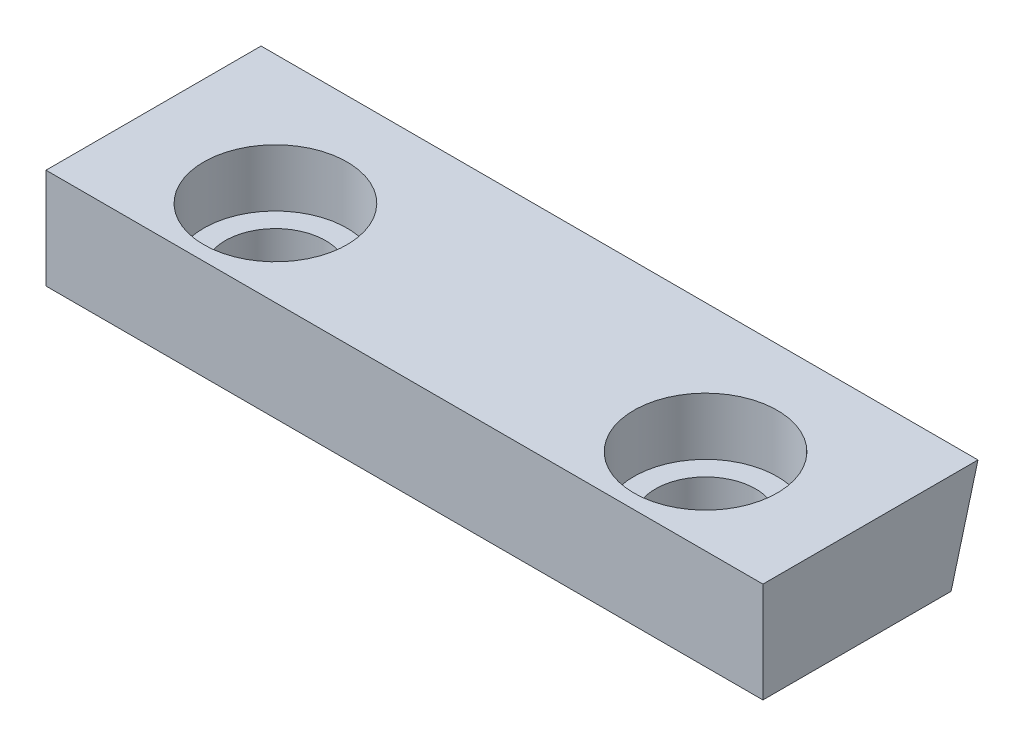
ISO-10303-21;
HEADER;
FILE_DESCRIPTION(('STEP AP214'),'2;1');
FILE_NAME('part.step','',(''),(''),'','','');
FILE_SCHEMA(('AUTOMOTIVE_DESIGN { 1 0 10303 214 1 1 1 1 }'));
ENDSEC;
DATA;
#1=APPLICATION_CONTEXT('core data for automotive mechanical design processes');
#2=APPLICATION_PROTOCOL_DEFINITION('international standard','automotive_design',2000,#1);
#3=PRODUCT_CONTEXT('',#1,'mechanical');
#4=PRODUCT('Part','Part','',(#3));
#5=PRODUCT_RELATED_PRODUCT_CATEGORY('part','',(#4));
#6=PRODUCT_DEFINITION_FORMATION('','',#4);
#7=PRODUCT_DEFINITION_CONTEXT('part definition',#1,'design');
#8=PRODUCT_DEFINITION('design','',#6,#7);
#9=PRODUCT_DEFINITION_SHAPE('','',#8);
#10=(LENGTH_UNIT() NAMED_UNIT(*) SI_UNIT(.MILLI.,.METRE.));
#11=(NAMED_UNIT(*) PLANE_ANGLE_UNIT() SI_UNIT($,.RADIAN.));
#12=(NAMED_UNIT(*) SI_UNIT($,.STERADIAN.) SOLID_ANGLE_UNIT());
#13=UNCERTAINTY_MEASURE_WITH_UNIT(LENGTH_MEASURE(1.E-05),#10,'distance_accuracy_value','');
#14=(GEOMETRIC_REPRESENTATION_CONTEXT(3) GLOBAL_UNCERTAINTY_ASSIGNED_CONTEXT((#13)) GLOBAL_UNIT_ASSIGNED_CONTEXT((#10,
#11,#12)) REPRESENTATION_CONTEXT('',''));
#15=CARTESIAN_POINT('',(0.,0.,0.));
#16=DIRECTION('',(0.,0.,1.));
#17=DIRECTION('',(1.,0.,0.));
#18=AXIS2_PLACEMENT_3D('',#15,#16,#17);
#19=CARTESIAN_POINT('',(-15.,7.,4.));
#20=DIRECTION('',(0.,1.,0.));
#21=DIRECTION('',(0.,0.,1.));
#22=AXIS2_PLACEMENT_3D('',#19,#20,#21);
#23=CYLINDRICAL_SURFACE('',#22,3.5);
#24=CARTESIAN_POINT('',(-15.,3.,4.));
#25=DIRECTION('',(0.,1.,0.));
#26=DIRECTION('',(0.,0.,1.));
#27=AXIS2_PLACEMENT_3D('',#24,#25,#26);
#28=CIRCLE('',#27,3.5);
#29=CARTESIAN_POINT('',(-15.,3.,7.5));
#30=VERTEX_POINT('',#29);
#31=EDGE_CURVE('E20',#30,#30,#28,.T.);
#32=ORIENTED_EDGE('',*,*,#31,.T.);
#33=EDGE_LOOP('',(#32));
#34=FACE_BOUND('',#33,.T.);
#35=CARTESIAN_POINT('',(-15.,0.,4.));
#36=DIRECTION('',(0.,1.,0.));
#37=DIRECTION('',(0.,0.,1.));
#38=AXIS2_PLACEMENT_3D('',#35,#36,#37);
#39=CIRCLE('',#38,3.5);
#40=CARTESIAN_POINT('',(-15.,0.,7.5));
#41=VERTEX_POINT('',#40);
#42=EDGE_CURVE('E96',#41,#41,#39,.T.);
#43=ORIENTED_EDGE('',*,*,#42,.F.);
#44=EDGE_LOOP('',(#43));
#45=FACE_BOUND('',#44,.T.);
#46=ADVANCED_FACE('F17',(#34,#45),#23,.F.);
#47=CARTESIAN_POINT('',(15.,7.,4.));
#48=DIRECTION('',(0.,1.,0.));
#49=DIRECTION('',(0.,0.,1.));
#50=AXIS2_PLACEMENT_3D('',#47,#48,#49);
#51=CYLINDRICAL_SURFACE('',#50,3.5);
#52=CARTESIAN_POINT('',(15.,3.,4.));
#53=DIRECTION('',(0.,1.,0.));
#54=DIRECTION('',(0.,0.,1.));
#55=AXIS2_PLACEMENT_3D('',#52,#53,#54);
#56=CIRCLE('',#55,3.5);
#57=CARTESIAN_POINT('',(15.,3.,7.5));
#58=VERTEX_POINT('',#57);
#59=EDGE_CURVE('E98',#58,#58,#56,.T.);
#60=ORIENTED_EDGE('',*,*,#59,.T.);
#61=EDGE_LOOP('',(#60));
#62=FACE_BOUND('',#61,.T.);
#63=CARTESIAN_POINT('',(15.,0.,4.));
#64=DIRECTION('',(0.,1.,0.));
#65=DIRECTION('',(0.,0.,1.));
#66=AXIS2_PLACEMENT_3D('',#63,#64,#65);
#67=CIRCLE('',#66,3.5);
#68=CARTESIAN_POINT('',(15.,0.,7.5));
#69=VERTEX_POINT('',#68);
#70=EDGE_CURVE('E93',#69,#69,#67,.T.);
#71=ORIENTED_EDGE('',*,*,#70,.F.);
#72=EDGE_LOOP('',(#71));
#73=FACE_BOUND('',#72,.T.);
#74=ADVANCED_FACE('F110',(#62,#73),#51,.F.);
#75=CARTESIAN_POINT('',(-11.5,3.,4.));
#76=DIRECTION('',(0.,-1.,0.));
#77=DIRECTION('',(0.,0.,-1.));
#78=AXIS2_PLACEMENT_3D('',#75,#76,#77);
#79=PLANE('',#78);
#80=CARTESIAN_POINT('',(-15.,3.,4.));
#81=DIRECTION('',(0.,1.,0.));
#82=DIRECTION('',(0.,0.,1.));
#83=AXIS2_PLACEMENT_3D('',#80,#81,#82);
#84=CIRCLE('',#83,5.);
#85=CARTESIAN_POINT('',(-15.,3.,9.));
#86=VERTEX_POINT('',#85);
#87=EDGE_CURVE('E90',#86,#86,#84,.T.);
#88=ORIENTED_EDGE('',*,*,#87,.T.);
#89=EDGE_LOOP('',(#88));
#90=FACE_BOUND('',#89,.T.);
#91=ORIENTED_EDGE('',*,*,#31,.F.);
#92=EDGE_LOOP('',(#91));
#93=FACE_BOUND('',#92,.T.);
#94=ADVANCED_FACE('F107',(#90,#93),#79,.F.);
#95=CARTESIAN_POINT('',(18.5,3.,4.));
#96=DIRECTION('',(0.,-1.,0.));
#97=DIRECTION('',(0.,0.,-1.));
#98=AXIS2_PLACEMENT_3D('',#95,#96,#97);
#99=PLANE('',#98);
#100=CARTESIAN_POINT('',(15.,3.,4.));
#101=DIRECTION('',(0.,1.,0.));
#102=DIRECTION('',(0.,0.,1.));
#103=AXIS2_PLACEMENT_3D('',#100,#101,#102);
#104=CIRCLE('',#103,5.);
#105=CARTESIAN_POINT('',(15.,3.,9.));
#106=VERTEX_POINT('',#105);
#107=EDGE_CURVE('E67',#106,#106,#104,.T.);
#108=ORIENTED_EDGE('',*,*,#107,.T.);
#109=EDGE_LOOP('',(#108));
#110=FACE_BOUND('',#109,.T.);
#111=ORIENTED_EDGE('',*,*,#59,.F.);
#112=EDGE_LOOP('',(#111));
#113=FACE_BOUND('',#112,.T.);
#114=ADVANCED_FACE('F109',(#110,#113),#99,.F.);
#115=CARTESIAN_POINT('',(0.,0.,0.));
#116=DIRECTION('',(0.,-1.,0.));
#117=DIRECTION('',(0.,0.,-1.));
#118=AXIS2_PLACEMENT_3D('',#115,#116,#117);
#119=PLANE('',#118);
#120=DIRECTION('',(0.,0.,1.));
#121=VECTOR('',#120,1.);
#122=CARTESIAN_POINT('',(25.,0.,10.));
#123=LINE('',#122,#121);
#124=CARTESIAN_POINT('',(25.,0.,-3.12435565298211));
#125=VERTEX_POINT('',#124);
#126=CARTESIAN_POINT('',(25.,0.,10.));
#127=VERTEX_POINT('',#126);
#128=EDGE_CURVE('E58',#125,#127,#123,.T.);
#129=ORIENTED_EDGE('',*,*,#128,.T.);
#130=DIRECTION('',(-1.,0.,0.));
#131=VECTOR('',#130,1.);
#132=CARTESIAN_POINT('',(-25.,0.,10.));
#133=LINE('',#132,#131);
#134=CARTESIAN_POINT('',(-25.,0.,10.));
#135=VERTEX_POINT('',#134);
#136=EDGE_CURVE('E55',#127,#135,#133,.T.);
#137=ORIENTED_EDGE('',*,*,#136,.T.);
#138=DIRECTION('',(0.,0.,-1.));
#139=VECTOR('',#138,1.);
#140=CARTESIAN_POINT('',(-25.,0.,10.));
#141=LINE('',#140,#139);
#142=CARTESIAN_POINT('',(-25.,0.,-3.12435565298211));
#143=VERTEX_POINT('',#142);
#144=EDGE_CURVE('E233',#135,#143,#141,.T.);
#145=ORIENTED_EDGE('',*,*,#144,.T.);
#146=DIRECTION('',(1.,0.,0.));
#147=VECTOR('',#146,1.);
#148=CARTESIAN_POINT('',(92.8808699119273,0.,-3.12435565298211));
#149=LINE('',#148,#147);
#150=EDGE_CURVE('E61',#125,#143,#149,.F.);
#151=ORIENTED_EDGE('',*,*,#150,.F.);
#152=EDGE_LOOP('',(#129,#137,#145,#151));
#153=FACE_BOUND('',#152,.T.);
#154=ORIENTED_EDGE('',*,*,#70,.T.);
#155=EDGE_LOOP('',(#154));
#156=FACE_BOUND('',#155,.T.);
#157=ORIENTED_EDGE('',*,*,#42,.T.);
#158=EDGE_LOOP('',(#157));
#159=FACE_BOUND('',#158,.T.);
#160=ADVANCED_FACE('F59',(#153,#156,#159),#119,.T.);
#161=CARTESIAN_POINT('',(-15.,7.,4.));
#162=DIRECTION('',(0.,1.,0.));
#163=DIRECTION('',(0.,0.,1.));
#164=AXIS2_PLACEMENT_3D('',#161,#162,#163);
#165=CYLINDRICAL_SURFACE('',#164,5.);
#166=ORIENTED_EDGE('',*,*,#87,.F.);
#167=EDGE_LOOP('',(#166));
#168=FACE_BOUND('',#167,.T.);
#169=CARTESIAN_POINT('',(-15.,7.,4.));
#170=DIRECTION('',(0.,1.,0.));
#171=DIRECTION('',(0.,0.,1.));
#172=AXIS2_PLACEMENT_3D('',#169,#170,#171);
#173=CIRCLE('',#172,5.);
#174=CARTESIAN_POINT('',(-15.,7.,9.));
#175=VERTEX_POINT('',#174);
#176=EDGE_CURVE('E85',#175,#175,#173,.T.);
#177=ORIENTED_EDGE('',*,*,#176,.T.);
#178=EDGE_LOOP('',(#177));
#179=FACE_BOUND('',#178,.T.);
#180=ADVANCED_FACE('F145',(#168,#179),#165,.F.);
#181=CARTESIAN_POINT('',(15.,7.,4.));
#182=DIRECTION('',(0.,1.,0.));
#183=DIRECTION('',(0.,0.,1.));
#184=AXIS2_PLACEMENT_3D('',#181,#182,#183);
#185=CYLINDRICAL_SURFACE('',#184,5.);
#186=ORIENTED_EDGE('',*,*,#107,.F.);
#187=EDGE_LOOP('',(#186));
#188=FACE_BOUND('',#187,.T.);
#189=CARTESIAN_POINT('',(15.,7.,4.));
#190=DIRECTION('',(0.,1.,0.));
#191=DIRECTION('',(0.,0.,1.));
#192=AXIS2_PLACEMENT_3D('',#189,#190,#191);
#193=CIRCLE('',#192,5.);
#194=CARTESIAN_POINT('',(15.,7.,9.));
#195=VERTEX_POINT('',#194);
#196=EDGE_CURVE('E82',#195,#195,#193,.T.);
#197=ORIENTED_EDGE('',*,*,#196,.T.);
#198=EDGE_LOOP('',(#197));
#199=FACE_BOUND('',#198,.T.);
#200=ADVANCED_FACE('F142',(#188,#199),#185,.F.);
#201=CARTESIAN_POINT('',(25.,7.,10.));
#202=DIRECTION('',(-1.,0.,0.));
#203=DIRECTION('',(0.,0.,1.));
#204=AXIS2_PLACEMENT_3D('',#201,#202,#203);
#205=PLANE('',#204);
#206=DIRECTION('',(0.,0.,-1.));
#207=VECTOR('',#206,1.);
#208=CARTESIAN_POINT('',(25.,7.,0.));
#209=LINE('',#208,#207);
#210=CARTESIAN_POINT('',(25.,7.,-5.));
#211=VERTEX_POINT('',#210);
#212=CARTESIAN_POINT('',(25.,7.,10.));
#213=VERTEX_POINT('',#212);
#214=EDGE_CURVE('E78',#211,#213,#209,.F.);
#215=ORIENTED_EDGE('',*,*,#214,.T.);
#216=DIRECTION('',(0.,1.,0.));
#217=VECTOR('',#216,1.);
#218=CARTESIAN_POINT('',(25.,7.,10.));
#219=LINE('',#218,#217);
#220=EDGE_CURVE('E66',#213,#127,#219,.F.);
#221=ORIENTED_EDGE('',*,*,#220,.T.);
#222=ORIENTED_EDGE('',*,*,#128,.F.);
#223=DIRECTION('',(0.,0.965925826289067,-0.258819045102525));
#224=VECTOR('',#223,1.);
#225=CARTESIAN_POINT('',(25.,7.,-5.));
#226=LINE('',#225,#224);
#227=EDGE_CURVE('E235',#211,#125,#226,.F.);
#228=ORIENTED_EDGE('',*,*,#227,.F.);
#229=EDGE_LOOP('',(#215,#221,#222,#228));
#230=FACE_BOUND('',#229,.T.);
#231=ADVANCED_FACE('F77',(#230),#205,.F.);
#232=CARTESIAN_POINT('',(-25.,7.,10.));
#233=DIRECTION('',(0.,0.,-1.));
#234=DIRECTION('',(-1.,0.,0.));
#235=AXIS2_PLACEMENT_3D('',#232,#233,#234);
#236=PLANE('',#235);
#237=ORIENTED_EDGE('',*,*,#220,.F.);
#238=DIRECTION('',(1.,0.,0.));
#239=VECTOR('',#238,1.);
#240=CARTESIAN_POINT('',(0.,7.,10.));
#241=LINE('',#240,#239);
#242=CARTESIAN_POINT('',(-25.,7.,10.));
#243=VERTEX_POINT('',#242);
#244=EDGE_CURVE('E242',#213,#243,#241,.F.);
#245=ORIENTED_EDGE('',*,*,#244,.T.);
#246=DIRECTION('',(0.,1.,0.));
#247=VECTOR('',#246,1.);
#248=CARTESIAN_POINT('',(-25.,7.,10.));
#249=LINE('',#248,#247);
#250=EDGE_CURVE('E74',#243,#135,#249,.F.);
#251=ORIENTED_EDGE('',*,*,#250,.T.);
#252=ORIENTED_EDGE('',*,*,#136,.F.);
#253=EDGE_LOOP('',(#237,#245,#251,#252));
#254=FACE_BOUND('',#253,.T.);
#255=ADVANCED_FACE('F71',(#254),#236,.F.);
#256=CARTESIAN_POINT('',(-25.,7.,10.));
#257=DIRECTION('',(1.,0.,0.));
#258=DIRECTION('',(0.,0.,-1.));
#259=AXIS2_PLACEMENT_3D('',#256,#257,#258);
#260=PLANE('',#259);
#261=ORIENTED_EDGE('',*,*,#144,.F.);
#262=ORIENTED_EDGE('',*,*,#250,.F.);
#263=DIRECTION('',(0.,0.,-1.));
#264=VECTOR('',#263,1.);
#265=CARTESIAN_POINT('',(-25.,7.,0.));
#266=LINE('',#265,#264);
#267=CARTESIAN_POINT('',(-25.,7.,-5.));
#268=VERTEX_POINT('',#267);
#269=EDGE_CURVE('E26',#243,#268,#266,.T.);
#270=ORIENTED_EDGE('',*,*,#269,.T.);
#271=DIRECTION('',(0.,0.965925826289067,-0.258819045102525));
#272=VECTOR('',#271,1.);
#273=CARTESIAN_POINT('',(-25.,7.,-5.));
#274=LINE('',#273,#272);
#275=EDGE_CURVE('E34',#143,#268,#274,.T.);
#276=ORIENTED_EDGE('',*,*,#275,.F.);
#277=EDGE_LOOP('',(#261,#262,#270,#276));
#278=FACE_BOUND('',#277,.T.);
#279=ADVANCED_FACE('F130',(#278),#260,.F.);
#280=CARTESIAN_POINT('',(92.8808699119273,7.,-5.));
#281=DIRECTION('',(0.,-0.258819045102525,-0.965925826289067));
#282=DIRECTION('',(0.,0.965925826289067,-0.258819045102525));
#283=AXIS2_PLACEMENT_3D('',#280,#281,#282);
#284=PLANE('',#283);
#285=ORIENTED_EDGE('',*,*,#150,.T.);
#286=ORIENTED_EDGE('',*,*,#275,.T.);
#287=DIRECTION('',(1.,0.,0.));
#288=VECTOR('',#287,1.);
#289=CARTESIAN_POINT('',(0.,7.,-5.));
#290=LINE('',#289,#288);
#291=EDGE_CURVE('E11',#268,#211,#290,.T.);
#292=ORIENTED_EDGE('',*,*,#291,.T.);
#293=ORIENTED_EDGE('',*,*,#227,.T.);
#294=EDGE_LOOP('',(#285,#286,#292,#293));
#295=FACE_BOUND('',#294,.T.);
#296=ADVANCED_FACE('F123',(#295),#284,.T.);
#297=CARTESIAN_POINT('',(0.,7.,0.));
#298=DIRECTION('',(0.,-1.,0.));
#299=DIRECTION('',(0.,0.,-1.));
#300=AXIS2_PLACEMENT_3D('',#297,#298,#299);
#301=PLANE('',#300);
#302=ORIENTED_EDGE('',*,*,#269,.F.);
#303=ORIENTED_EDGE('',*,*,#244,.F.);
#304=ORIENTED_EDGE('',*,*,#214,.F.);
#305=ORIENTED_EDGE('',*,*,#291,.F.);
#306=EDGE_LOOP('',(#302,#303,#304,#305));
#307=FACE_BOUND('',#306,.T.);
#308=ORIENTED_EDGE('',*,*,#196,.F.);
#309=EDGE_LOOP('',(#308));
#310=FACE_BOUND('',#309,.T.);
#311=ORIENTED_EDGE('',*,*,#176,.F.);
#312=EDGE_LOOP('',(#311));
#313=FACE_BOUND('',#312,.T.);
#314=ADVANCED_FACE('F121',(#307,#310,#313),#301,.F.);
#315=CLOSED_SHELL('',(#46,#74,#94,#114,#160,#180,#200,#231,#255,#279,#296,#314));
#316=MANIFOLD_SOLID_BREP('B1',#315);
#317=ADVANCED_BREP_SHAPE_REPRESENTATION('',(#18,#316),#14);
#318=SHAPE_DEFINITION_REPRESENTATION(#9,#317);
ENDSEC;
END-ISO-10303-21;
